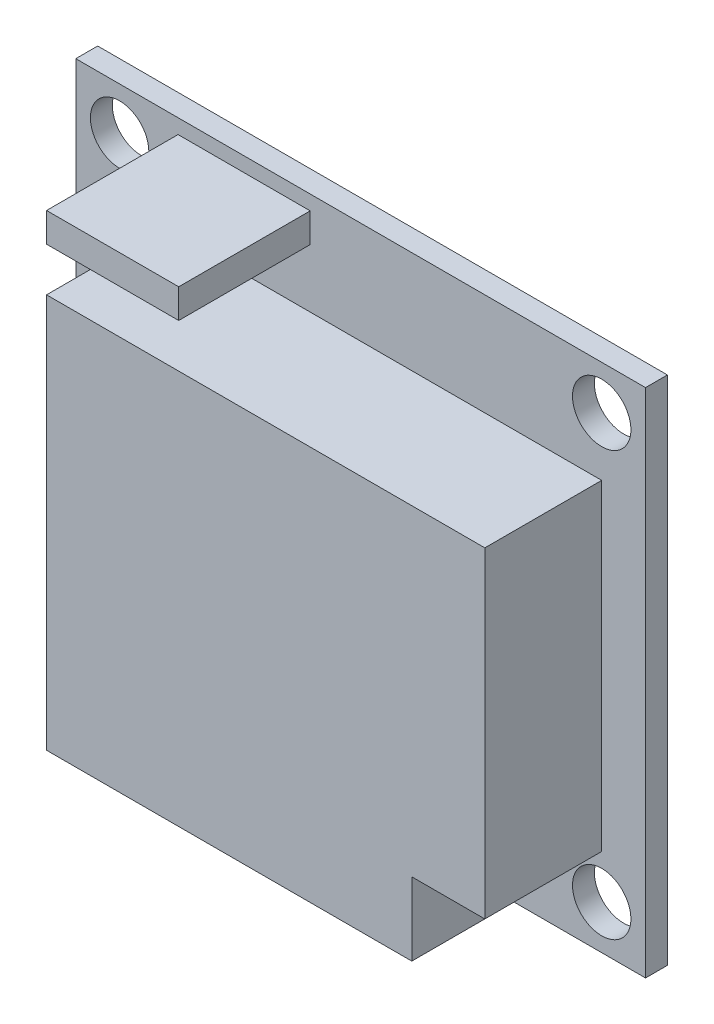
ISO-10303-21;
HEADER;
FILE_DESCRIPTION(('STEP AP214'),'2;1');
FILE_NAME('part.step','',(''),(''),'','','');
FILE_SCHEMA(('AUTOMOTIVE_DESIGN { 1 0 10303 214 1 1 1 1 }'));
ENDSEC;
DATA;
#1=APPLICATION_CONTEXT('core data for automotive mechanical design processes');
#2=APPLICATION_PROTOCOL_DEFINITION('international standard','automotive_design',2000,#1);
#3=PRODUCT_CONTEXT('',#1,'mechanical');
#4=PRODUCT('Part','Part','',(#3));
#5=PRODUCT_RELATED_PRODUCT_CATEGORY('part','',(#4));
#6=PRODUCT_DEFINITION_FORMATION('','',#4);
#7=PRODUCT_DEFINITION_CONTEXT('part definition',#1,'design');
#8=PRODUCT_DEFINITION('design','',#6,#7);
#9=PRODUCT_DEFINITION_SHAPE('','',#8);
#10=(LENGTH_UNIT() NAMED_UNIT(*) SI_UNIT(.MILLI.,.METRE.));
#11=(NAMED_UNIT(*) PLANE_ANGLE_UNIT() SI_UNIT($,.RADIAN.));
#12=(NAMED_UNIT(*) SI_UNIT($,.STERADIAN.) SOLID_ANGLE_UNIT());
#13=UNCERTAINTY_MEASURE_WITH_UNIT(LENGTH_MEASURE(1.E-05),#10,'distance_accuracy_value','');
#14=(GEOMETRIC_REPRESENTATION_CONTEXT(3) GLOBAL_UNCERTAINTY_ASSIGNED_CONTEXT((#13)) GLOBAL_UNIT_ASSIGNED_CONTEXT((#10,
#11,#12)) REPRESENTATION_CONTEXT('',''));
#15=CARTESIAN_POINT('',(0.,0.,0.));
#16=DIRECTION('',(0.,0.,1.));
#17=DIRECTION('',(1.,0.,0.));
#18=AXIS2_PLACEMENT_3D('',#15,#16,#17);
#19=CARTESIAN_POINT('',(0.,0.,1.5));
#20=DIRECTION('',(0.,0.,-1.));
#21=DIRECTION('',(-1.,0.,0.));
#22=AXIS2_PLACEMENT_3D('',#19,#20,#21);
#23=PLANE('',#22);
#24=DIRECTION('',(0.,-1.,0.));
#25=VECTOR('',#24,1.);
#26=CARTESIAN_POINT('',(-12.5,16.5,1.5));
#27=LINE('',#26,#25);
#28=CARTESIAN_POINT('',(-12.5,16.5,1.5));
#29=VERTEX_POINT('',#28);
#30=CARTESIAN_POINT('',(-12.5,14.5,1.5));
#31=VERTEX_POINT('',#30);
#32=EDGE_CURVE('E165',#29,#31,#27,.T.);
#33=ORIENTED_EDGE('',*,*,#32,.F.);
#34=DIRECTION('',(-1.,0.,0.));
#35=VECTOR('',#34,1.);
#36=CARTESIAN_POINT('',(-12.5,16.5,1.5));
#37=LINE('',#36,#35);
#38=CARTESIAN_POINT('',(-3.45411790643712,16.5,1.5));
#39=VERTEX_POINT('',#38);
#40=EDGE_CURVE('E181',#39,#29,#37,.T.);
#41=ORIENTED_EDGE('',*,*,#40,.F.);
#42=DIRECTION('',(0.,1.,0.));
#43=VECTOR('',#42,1.);
#44=CARTESIAN_POINT('',(-3.45411790643712,16.5,1.5));
#45=LINE('',#44,#43);
#46=CARTESIAN_POINT('',(-3.45411790643712,14.5,1.5));
#47=VERTEX_POINT('',#46);
#48=EDGE_CURVE('E194',#47,#39,#45,.T.);
#49=ORIENTED_EDGE('',*,*,#48,.F.);
#50=DIRECTION('',(1.,0.,0.));
#51=VECTOR('',#50,1.);
#52=CARTESIAN_POINT('',(-12.5,14.5,1.5));
#53=LINE('',#52,#51);
#54=EDGE_CURVE('E170',#31,#47,#53,.T.);
#55=ORIENTED_EDGE('',*,*,#54,.F.);
#56=EDGE_LOOP('',(#33,#41,#49,#55));
#57=FACE_BOUND('',#56,.T.);
#58=CARTESIAN_POINT('',(-16.5,14.5,1.5));
#59=DIRECTION('',(0.,0.,1.));
#60=DIRECTION('',(1.,0.,0.));
#61=AXIS2_PLACEMENT_3D('',#58,#59,#60);
#62=CIRCLE('',#61,2.);
#63=CARTESIAN_POINT('',(-14.5,14.5,1.5));
#64=VERTEX_POINT('',#63);
#65=EDGE_CURVE('E220',#64,#64,#62,.T.);
#66=ORIENTED_EDGE('',*,*,#65,.F.);
#67=EDGE_LOOP('',(#66));
#68=FACE_BOUND('',#67,.T.);
#69=CARTESIAN_POINT('',(16.5,14.5,1.5));
#70=DIRECTION('',(0.,0.,1.));
#71=DIRECTION('',(1.,0.,0.));
#72=AXIS2_PLACEMENT_3D('',#69,#70,#71);
#73=CIRCLE('',#72,2.);
#74=CARTESIAN_POINT('',(18.5,14.5,1.5));
#75=VERTEX_POINT('',#74);
#76=EDGE_CURVE('E225',#75,#75,#73,.T.);
#77=ORIENTED_EDGE('',*,*,#76,.F.);
#78=EDGE_LOOP('',(#77));
#79=FACE_BOUND('',#78,.T.);
#80=DIRECTION('',(0.,1.,0.));
#81=VECTOR('',#80,1.);
#82=CARTESIAN_POINT('',(19.5,-17.5,1.5));
#83=LINE('',#82,#81);
#84=CARTESIAN_POINT('',(19.5,-17.5,1.5));
#85=VERTEX_POINT('',#84);
#86=CARTESIAN_POINT('',(19.5,17.5,1.5));
#87=VERTEX_POINT('',#86);
#88=EDGE_CURVE('E233',#85,#87,#83,.T.);
#89=ORIENTED_EDGE('',*,*,#88,.T.);
#90=DIRECTION('',(-1.,0.,0.));
#91=VECTOR('',#90,1.);
#92=CARTESIAN_POINT('',(-19.5,17.5,1.5));
#93=LINE('',#92,#91);
#94=CARTESIAN_POINT('',(-19.5,17.5,1.5));
#95=VERTEX_POINT('',#94);
#96=EDGE_CURVE('E237',#87,#95,#93,.T.);
#97=ORIENTED_EDGE('',*,*,#96,.T.);
#98=DIRECTION('',(0.,-1.,0.));
#99=VECTOR('',#98,1.);
#100=CARTESIAN_POINT('',(-19.5,-17.5,1.5));
#101=LINE('',#100,#99);
#102=CARTESIAN_POINT('',(-19.5,-17.5,1.5));
#103=VERTEX_POINT('',#102);
#104=EDGE_CURVE('E241',#95,#103,#101,.T.);
#105=ORIENTED_EDGE('',*,*,#104,.T.);
#106=DIRECTION('',(1.,0.,0.));
#107=VECTOR('',#106,1.);
#108=CARTESIAN_POINT('',(-19.5,-17.5,1.5));
#109=LINE('',#108,#107);
#110=EDGE_CURVE('E244',#103,#85,#109,.T.);
#111=ORIENTED_EDGE('',*,*,#110,.T.);
#112=EDGE_LOOP('',(#89,#97,#105,#111));
#113=FACE_BOUND('',#112,.T.);
#114=CARTESIAN_POINT('',(16.5,-14.5,1.5));
#115=DIRECTION('',(0.,0.,1.));
#116=DIRECTION('',(1.,0.,0.));
#117=AXIS2_PLACEMENT_3D('',#114,#115,#116);
#118=CIRCLE('',#117,2.);
#119=CARTESIAN_POINT('',(18.5,-14.5,1.5));
#120=VERTEX_POINT('',#119);
#121=EDGE_CURVE('E278',#120,#120,#118,.T.);
#122=ORIENTED_EDGE('',*,*,#121,.F.);
#123=EDGE_LOOP('',(#122));
#124=FACE_BOUND('',#123,.T.);
#125=CARTESIAN_POINT('',(-16.5,-14.5,1.5));
#126=DIRECTION('',(0.,0.,1.));
#127=DIRECTION('',(1.,0.,0.));
#128=AXIS2_PLACEMENT_3D('',#125,#126,#127);
#129=CIRCLE('',#128,2.);
#130=CARTESIAN_POINT('',(-14.5,-14.5,1.5));
#131=VERTEX_POINT('',#130);
#132=EDGE_CURVE('E11',#131,#131,#129,.T.);
#133=ORIENTED_EDGE('',*,*,#132,.F.);
#134=EDGE_LOOP('',(#133));
#135=FACE_BOUND('',#134,.T.);
#136=DIRECTION('',(0.,-1.,0.));
#137=VECTOR('',#136,1.);
#138=CARTESIAN_POINT('',(-13.5,10.5,1.5));
#139=LINE('',#138,#137);
#140=CARTESIAN_POINT('',(-13.5,10.5,1.5));
#141=VERTEX_POINT('',#140);
#142=CARTESIAN_POINT('',(-13.5,-16.5,1.5));
#143=VERTEX_POINT('',#142);
#144=EDGE_CURVE('E163',#141,#143,#139,.T.);
#145=ORIENTED_EDGE('',*,*,#144,.F.);
#146=DIRECTION('',(-1.,0.,0.));
#147=VECTOR('',#146,1.);
#148=CARTESIAN_POINT('',(-13.5,10.5,1.5));
#149=LINE('',#148,#147);
#150=CARTESIAN_POINT('',(16.5,10.5,1.5));
#151=VERTEX_POINT('',#150);
#152=EDGE_CURVE('E160',#151,#141,#149,.T.);
#153=ORIENTED_EDGE('',*,*,#152,.F.);
#154=DIRECTION('',(0.,1.,0.));
#155=VECTOR('',#154,1.);
#156=CARTESIAN_POINT('',(16.5,10.5,1.5));
#157=LINE('',#156,#155);
#158=CARTESIAN_POINT('',(16.5,-11.5,1.5));
#159=VERTEX_POINT('',#158);
#160=EDGE_CURVE('E306',#159,#151,#157,.T.);
#161=ORIENTED_EDGE('',*,*,#160,.F.);
#162=DIRECTION('',(1.,0.,0.));
#163=VECTOR('',#162,1.);
#164=CARTESIAN_POINT('',(11.5,-11.5,1.5));
#165=LINE('',#164,#163);
#166=CARTESIAN_POINT('',(11.5,-11.5,1.5));
#167=VERTEX_POINT('',#166);
#168=EDGE_CURVE('E328',#167,#159,#165,.T.);
#169=ORIENTED_EDGE('',*,*,#168,.F.);
#170=DIRECTION('',(0.,1.,0.));
#171=VECTOR('',#170,1.);
#172=CARTESIAN_POINT('',(11.5,-16.5,1.5));
#173=LINE('',#172,#171);
#174=CARTESIAN_POINT('',(11.5,-16.5,1.5));
#175=VERTEX_POINT('',#174);
#176=EDGE_CURVE('E60',#175,#167,#173,.T.);
#177=ORIENTED_EDGE('',*,*,#176,.F.);
#178=DIRECTION('',(1.,0.,0.));
#179=VECTOR('',#178,1.);
#180=CARTESIAN_POINT('',(-13.5,-16.5,1.5));
#181=LINE('',#180,#179);
#182=EDGE_CURVE('E55',#143,#175,#181,.T.);
#183=ORIENTED_EDGE('',*,*,#182,.F.);
#184=EDGE_LOOP('',(#145,#153,#161,#169,#177,#183));
#185=FACE_BOUND('',#184,.T.);
#186=ADVANCED_FACE('F39',(#57,#68,#79,#113,#124,#135,#185),#23,.F.);
#187=CARTESIAN_POINT('',(-16.5,-14.5,-0.000999999999999916));
#188=DIRECTION('',(0.,0.,1.));
#189=DIRECTION('',(1.,0.,0.));
#190=AXIS2_PLACEMENT_3D('',#187,#188,#189);
#191=CYLINDRICAL_SURFACE('',#190,2.);
#192=CARTESIAN_POINT('',(-16.5,-14.5,0.));
#193=DIRECTION('',(0.,0.,-1.));
#194=DIRECTION('',(-1.,0.,0.));
#195=AXIS2_PLACEMENT_3D('',#192,#193,#194);
#196=CIRCLE('',#195,2.);
#197=CARTESIAN_POINT('',(-18.5,-14.5,0.));
#198=VERTEX_POINT('',#197);
#199=EDGE_CURVE('E48',#198,#198,#196,.F.);
#200=ORIENTED_EDGE('',*,*,#199,.F.);
#201=EDGE_LOOP('',(#200));
#202=FACE_BOUND('',#201,.T.);
#203=ORIENTED_EDGE('',*,*,#132,.T.);
#204=EDGE_LOOP('',(#203));
#205=FACE_BOUND('',#204,.T.);
#206=ADVANCED_FACE('F41',(#202,#205),#191,.F.);
#207=CARTESIAN_POINT('',(16.5,-14.5,-0.000999999999999916));
#208=DIRECTION('',(0.,0.,1.));
#209=DIRECTION('',(1.,0.,0.));
#210=AXIS2_PLACEMENT_3D('',#207,#208,#209);
#211=CYLINDRICAL_SURFACE('',#210,2.);
#212=CARTESIAN_POINT('',(16.5,-14.5,0.));
#213=DIRECTION('',(0.,0.,-1.));
#214=DIRECTION('',(-1.,0.,0.));
#215=AXIS2_PLACEMENT_3D('',#212,#213,#214);
#216=CIRCLE('',#215,2.);
#217=CARTESIAN_POINT('',(14.5,-14.5,0.));
#218=VERTEX_POINT('',#217);
#219=EDGE_CURVE('E274',#218,#218,#216,.F.);
#220=ORIENTED_EDGE('',*,*,#219,.F.);
#221=EDGE_LOOP('',(#220));
#222=FACE_BOUND('',#221,.T.);
#223=ORIENTED_EDGE('',*,*,#121,.T.);
#224=EDGE_LOOP('',(#223));
#225=FACE_BOUND('',#224,.T.);
#226=ADVANCED_FACE('F289',(#222,#225),#211,.F.);
#227=CARTESIAN_POINT('',(19.5,-17.5,1.5));
#228=DIRECTION('',(-1.,0.,0.));
#229=DIRECTION('',(0.,0.,1.));
#230=AXIS2_PLACEMENT_3D('',#227,#228,#229);
#231=PLANE('',#230);
#232=DIRECTION('',(0.,1.,0.));
#233=VECTOR('',#232,1.);
#234=CARTESIAN_POINT('',(19.5,-17.5,0.));
#235=LINE('',#234,#233);
#236=CARTESIAN_POINT('',(19.5,-17.5,0.));
#237=VERTEX_POINT('',#236);
#238=CARTESIAN_POINT('',(19.5,17.5,0.));
#239=VERTEX_POINT('',#238);
#240=EDGE_CURVE('E229',#237,#239,#235,.T.);
#241=ORIENTED_EDGE('',*,*,#240,.T.);
#242=DIRECTION('',(0.,0.,-1.));
#243=VECTOR('',#242,1.);
#244=CARTESIAN_POINT('',(19.5,17.5,1.5));
#245=LINE('',#244,#243);
#246=EDGE_CURVE('E270',#87,#239,#245,.T.);
#247=ORIENTED_EDGE('',*,*,#246,.F.);
#248=ORIENTED_EDGE('',*,*,#88,.F.);
#249=DIRECTION('',(0.,0.,-1.));
#250=VECTOR('',#249,1.);
#251=CARTESIAN_POINT('',(19.5,-17.5,1.5));
#252=LINE('',#251,#250);
#253=EDGE_CURVE('E247',#85,#237,#252,.T.);
#254=ORIENTED_EDGE('',*,*,#253,.T.);
#255=EDGE_LOOP('',(#241,#247,#248,#254));
#256=FACE_BOUND('',#255,.T.);
#257=ADVANCED_FACE('F406',(#256),#231,.F.);
#258=CARTESIAN_POINT('',(-19.5,17.5,1.5));
#259=DIRECTION('',(0.,-1.,0.));
#260=DIRECTION('',(0.,0.,-1.));
#261=AXIS2_PLACEMENT_3D('',#258,#259,#260);
#262=PLANE('',#261);
#263=DIRECTION('',(-1.,0.,0.));
#264=VECTOR('',#263,1.);
#265=CARTESIAN_POINT('',(-19.5,17.5,0.));
#266=LINE('',#265,#264);
#267=CARTESIAN_POINT('',(-19.5,17.5,0.));
#268=VERTEX_POINT('',#267);
#269=EDGE_CURVE('E251',#239,#268,#266,.T.);
#270=ORIENTED_EDGE('',*,*,#269,.T.);
#271=DIRECTION('',(0.,0.,-1.));
#272=VECTOR('',#271,1.);
#273=CARTESIAN_POINT('',(-19.5,17.5,1.5));
#274=LINE('',#273,#272);
#275=EDGE_CURVE('E266',#95,#268,#274,.T.);
#276=ORIENTED_EDGE('',*,*,#275,.F.);
#277=ORIENTED_EDGE('',*,*,#96,.F.);
#278=ORIENTED_EDGE('',*,*,#246,.T.);
#279=EDGE_LOOP('',(#270,#276,#277,#278));
#280=FACE_BOUND('',#279,.T.);
#281=ADVANCED_FACE('F402',(#280),#262,.F.);
#282=CARTESIAN_POINT('',(-19.5,-17.5,1.5));
#283=DIRECTION('',(1.,0.,0.));
#284=DIRECTION('',(0.,0.,-1.));
#285=AXIS2_PLACEMENT_3D('',#282,#283,#284);
#286=PLANE('',#285);
#287=DIRECTION('',(0.,-1.,0.));
#288=VECTOR('',#287,1.);
#289=CARTESIAN_POINT('',(-19.5,-17.5,0.));
#290=LINE('',#289,#288);
#291=CARTESIAN_POINT('',(-19.5,-17.5,0.));
#292=VERTEX_POINT('',#291);
#293=EDGE_CURVE('E254',#268,#292,#290,.T.);
#294=ORIENTED_EDGE('',*,*,#293,.T.);
#295=DIRECTION('',(0.,0.,-1.));
#296=VECTOR('',#295,1.);
#297=CARTESIAN_POINT('',(-19.5,-17.5,1.5));
#298=LINE('',#297,#296);
#299=EDGE_CURVE('E262',#103,#292,#298,.T.);
#300=ORIENTED_EDGE('',*,*,#299,.F.);
#301=ORIENTED_EDGE('',*,*,#104,.F.);
#302=ORIENTED_EDGE('',*,*,#275,.T.);
#303=EDGE_LOOP('',(#294,#300,#301,#302));
#304=FACE_BOUND('',#303,.T.);
#305=ADVANCED_FACE('F398',(#304),#286,.F.);
#306=CARTESIAN_POINT('',(-19.5,-17.5,1.5));
#307=DIRECTION('',(0.,1.,0.));
#308=DIRECTION('',(0.,0.,1.));
#309=AXIS2_PLACEMENT_3D('',#306,#307,#308);
#310=PLANE('',#309);
#311=DIRECTION('',(1.,0.,0.));
#312=VECTOR('',#311,1.);
#313=CARTESIAN_POINT('',(-19.5,-17.5,0.));
#314=LINE('',#313,#312);
#315=EDGE_CURVE('E238',#292,#237,#314,.T.);
#316=ORIENTED_EDGE('',*,*,#315,.T.);
#317=ORIENTED_EDGE('',*,*,#253,.F.);
#318=ORIENTED_EDGE('',*,*,#110,.F.);
#319=ORIENTED_EDGE('',*,*,#299,.T.);
#320=EDGE_LOOP('',(#316,#317,#318,#319));
#321=FACE_BOUND('',#320,.T.);
#322=ADVANCED_FACE('F394',(#321),#310,.F.);
#323=CARTESIAN_POINT('',(0.,0.,0.));
#324=DIRECTION('',(0.,0.,-1.));
#325=DIRECTION('',(-1.,0.,0.));
#326=AXIS2_PLACEMENT_3D('',#323,#324,#325);
#327=PLANE('',#326);
#328=CARTESIAN_POINT('',(-16.5,14.5,0.));
#329=DIRECTION('',(0.,0.,-1.));
#330=DIRECTION('',(-1.,0.,0.));
#331=AXIS2_PLACEMENT_3D('',#328,#329,#330);
#332=CIRCLE('',#331,2.);
#333=CARTESIAN_POINT('',(-18.5,14.5,0.));
#334=VERTEX_POINT('',#333);
#335=EDGE_CURVE('E216',#334,#334,#332,.F.);
#336=ORIENTED_EDGE('',*,*,#335,.T.);
#337=EDGE_LOOP('',(#336));
#338=FACE_BOUND('',#337,.T.);
#339=CARTESIAN_POINT('',(16.5,14.5,0.));
#340=DIRECTION('',(0.,0.,-1.));
#341=DIRECTION('',(-1.,0.,0.));
#342=AXIS2_PLACEMENT_3D('',#339,#340,#341);
#343=CIRCLE('',#342,2.);
#344=CARTESIAN_POINT('',(14.5,14.5,0.));
#345=VERTEX_POINT('',#344);
#346=EDGE_CURVE('E224',#345,#345,#343,.F.);
#347=ORIENTED_EDGE('',*,*,#346,.T.);
#348=EDGE_LOOP('',(#347));
#349=FACE_BOUND('',#348,.T.);
#350=ORIENTED_EDGE('',*,*,#240,.F.);
#351=ORIENTED_EDGE('',*,*,#315,.F.);
#352=ORIENTED_EDGE('',*,*,#293,.F.);
#353=ORIENTED_EDGE('',*,*,#269,.F.);
#354=EDGE_LOOP('',(#350,#351,#352,#353));
#355=FACE_BOUND('',#354,.T.);
#356=ORIENTED_EDGE('',*,*,#219,.T.);
#357=EDGE_LOOP('',(#356));
#358=FACE_BOUND('',#357,.T.);
#359=ORIENTED_EDGE('',*,*,#199,.T.);
#360=EDGE_LOOP('',(#359));
#361=FACE_BOUND('',#360,.T.);
#362=ADVANCED_FACE('F285',(#338,#349,#355,#358,#361),#327,.T.);
#363=CARTESIAN_POINT('',(16.5,14.5,-0.000999999999999916));
#364=DIRECTION('',(0.,0.,1.));
#365=DIRECTION('',(1.,0.,0.));
#366=AXIS2_PLACEMENT_3D('',#363,#364,#365);
#367=CYLINDRICAL_SURFACE('',#366,2.);
#368=ORIENTED_EDGE('',*,*,#346,.F.);
#369=EDGE_LOOP('',(#368));
#370=FACE_BOUND('',#369,.T.);
#371=ORIENTED_EDGE('',*,*,#76,.T.);
#372=EDGE_LOOP('',(#371));
#373=FACE_BOUND('',#372,.T.);
#374=ADVANCED_FACE('F387',(#370,#373),#367,.F.);
#375=CARTESIAN_POINT('',(-16.5,14.5,-0.000999999999999916));
#376=DIRECTION('',(0.,0.,1.));
#377=DIRECTION('',(1.,0.,0.));
#378=AXIS2_PLACEMENT_3D('',#375,#376,#377);
#379=CYLINDRICAL_SURFACE('',#378,2.);
#380=ORIENTED_EDGE('',*,*,#335,.F.);
#381=EDGE_LOOP('',(#380));
#382=FACE_BOUND('',#381,.T.);
#383=ORIENTED_EDGE('',*,*,#65,.T.);
#384=EDGE_LOOP('',(#383));
#385=FACE_BOUND('',#384,.T.);
#386=ADVANCED_FACE('F383',(#382,#385),#379,.F.);
#387=CARTESIAN_POINT('',(-12.5,16.5,10.5));
#388=DIRECTION('',(1.,0.,0.));
#389=DIRECTION('',(0.,0.,-1.));
#390=AXIS2_PLACEMENT_3D('',#387,#388,#389);
#391=PLANE('',#390);
#392=ORIENTED_EDGE('',*,*,#32,.T.);
#393=DIRECTION('',(0.,0.,-1.));
#394=VECTOR('',#393,1.);
#395=CARTESIAN_POINT('',(-12.5,14.5,10.5));
#396=LINE('',#395,#394);
#397=CARTESIAN_POINT('',(-12.5,14.5,10.5));
#398=VERTEX_POINT('',#397);
#399=EDGE_CURVE('E212',#398,#31,#396,.T.);
#400=ORIENTED_EDGE('',*,*,#399,.F.);
#401=DIRECTION('',(0.,-1.,0.));
#402=VECTOR('',#401,1.);
#403=CARTESIAN_POINT('',(-12.5,16.5,10.5));
#404=LINE('',#403,#402);
#405=CARTESIAN_POINT('',(-12.5,16.5,10.5));
#406=VERTEX_POINT('',#405);
#407=EDGE_CURVE('E176',#406,#398,#404,.T.);
#408=ORIENTED_EDGE('',*,*,#407,.F.);
#409=DIRECTION('',(0.,0.,-1.));
#410=VECTOR('',#409,1.);
#411=CARTESIAN_POINT('',(-12.5,16.5,10.5));
#412=LINE('',#411,#410);
#413=EDGE_CURVE('E189',#406,#29,#412,.T.);
#414=ORIENTED_EDGE('',*,*,#413,.T.);
#415=EDGE_LOOP('',(#392,#400,#408,#414));
#416=FACE_BOUND('',#415,.T.);
#417=ADVANCED_FACE('F379',(#416),#391,.F.);
#418=CARTESIAN_POINT('',(-12.5,14.5,10.5));
#419=DIRECTION('',(0.,1.,0.));
#420=DIRECTION('',(0.,0.,1.));
#421=AXIS2_PLACEMENT_3D('',#418,#419,#420);
#422=PLANE('',#421);
#423=ORIENTED_EDGE('',*,*,#54,.T.);
#424=DIRECTION('',(0.,0.,-1.));
#425=VECTOR('',#424,1.);
#426=CARTESIAN_POINT('',(-3.45411790643712,14.5,10.5));
#427=LINE('',#426,#425);
#428=CARTESIAN_POINT('',(-3.45411790643712,14.5,10.5));
#429=VERTEX_POINT('',#428);
#430=EDGE_CURVE('E208',#429,#47,#427,.T.);
#431=ORIENTED_EDGE('',*,*,#430,.F.);
#432=DIRECTION('',(1.,0.,0.));
#433=VECTOR('',#432,1.);
#434=CARTESIAN_POINT('',(-12.5,14.5,10.5));
#435=LINE('',#434,#433);
#436=EDGE_CURVE('E180',#398,#429,#435,.T.);
#437=ORIENTED_EDGE('',*,*,#436,.F.);
#438=ORIENTED_EDGE('',*,*,#399,.T.);
#439=EDGE_LOOP('',(#423,#431,#437,#438));
#440=FACE_BOUND('',#439,.T.);
#441=ADVANCED_FACE('F375',(#440),#422,.F.);
#442=CARTESIAN_POINT('',(-3.45411790643712,16.5,10.5));
#443=DIRECTION('',(-1.,0.,0.));
#444=DIRECTION('',(0.,-1.,0.));
#445=AXIS2_PLACEMENT_3D('',#442,#443,#444);
#446=PLANE('',#445);
#447=ORIENTED_EDGE('',*,*,#48,.T.);
#448=DIRECTION('',(0.,0.,-1.));
#449=VECTOR('',#448,1.);
#450=CARTESIAN_POINT('',(-3.45411790643712,16.5,10.5));
#451=LINE('',#450,#449);
#452=CARTESIAN_POINT('',(-3.45411790643712,16.5,10.5));
#453=VERTEX_POINT('',#452);
#454=EDGE_CURVE('E204',#453,#39,#451,.T.);
#455=ORIENTED_EDGE('',*,*,#454,.F.);
#456=DIRECTION('',(0.,1.,0.));
#457=VECTOR('',#456,1.);
#458=CARTESIAN_POINT('',(-3.45411790643712,16.5,10.5));
#459=LINE('',#458,#457);
#460=EDGE_CURVE('E184',#429,#453,#459,.T.);
#461=ORIENTED_EDGE('',*,*,#460,.F.);
#462=ORIENTED_EDGE('',*,*,#430,.T.);
#463=EDGE_LOOP('',(#447,#455,#461,#462));
#464=FACE_BOUND('',#463,.T.);
#465=ADVANCED_FACE('F371',(#464),#446,.F.);
#466=CARTESIAN_POINT('',(-12.5,16.5,10.5));
#467=DIRECTION('',(0.,-1.,0.));
#468=DIRECTION('',(0.,0.,-1.));
#469=AXIS2_PLACEMENT_3D('',#466,#467,#468);
#470=PLANE('',#469);
#471=ORIENTED_EDGE('',*,*,#40,.T.);
#472=ORIENTED_EDGE('',*,*,#413,.F.);
#473=DIRECTION('',(-1.,0.,0.));
#474=VECTOR('',#473,1.);
#475=CARTESIAN_POINT('',(-12.5,16.5,10.5));
#476=LINE('',#475,#474);
#477=EDGE_CURVE('E187',#453,#406,#476,.T.);
#478=ORIENTED_EDGE('',*,*,#477,.F.);
#479=ORIENTED_EDGE('',*,*,#454,.T.);
#480=EDGE_LOOP('',(#471,#472,#478,#479));
#481=FACE_BOUND('',#480,.T.);
#482=ADVANCED_FACE('F367',(#481),#470,.F.);
#483=CARTESIAN_POINT('',(0.,0.,10.5));
#484=DIRECTION('',(0.,0.,1.));
#485=DIRECTION('',(1.,0.,0.));
#486=AXIS2_PLACEMENT_3D('',#483,#484,#485);
#487=PLANE('',#486);
#488=ORIENTED_EDGE('',*,*,#407,.T.);
#489=ORIENTED_EDGE('',*,*,#436,.T.);
#490=ORIENTED_EDGE('',*,*,#460,.T.);
#491=ORIENTED_EDGE('',*,*,#477,.T.);
#492=EDGE_LOOP('',(#488,#489,#490,#491));
#493=FACE_BOUND('',#492,.T.);
#494=ADVANCED_FACE('F364',(#493),#487,.T.);
#495=CARTESIAN_POINT('',(-13.5,10.5,9.5));
#496=DIRECTION('',(1.,0.,0.));
#497=DIRECTION('',(0.,1.,0.));
#498=AXIS2_PLACEMENT_3D('',#495,#496,#497);
#499=PLANE('',#498);
#500=ORIENTED_EDGE('',*,*,#144,.T.);
#501=DIRECTION('',(0.,0.,-1.));
#502=VECTOR('',#501,1.);
#503=CARTESIAN_POINT('',(-13.5,-16.5,9.5));
#504=LINE('',#503,#502);
#505=CARTESIAN_POINT('',(-13.5,-16.5,9.5));
#506=VERTEX_POINT('',#505);
#507=EDGE_CURVE('E142',#506,#143,#504,.T.);
#508=ORIENTED_EDGE('',*,*,#507,.F.);
#509=DIRECTION('',(0.,-1.,0.));
#510=VECTOR('',#509,1.);
#511=CARTESIAN_POINT('',(-13.5,10.5,9.5));
#512=LINE('',#511,#510);
#513=CARTESIAN_POINT('',(-13.5,10.5,9.5));
#514=VERTEX_POINT('',#513);
#515=EDGE_CURVE('E150',#514,#506,#512,.T.);
#516=ORIENTED_EDGE('',*,*,#515,.F.);
#517=DIRECTION('',(0.,0.,-1.));
#518=VECTOR('',#517,1.);
#519=CARTESIAN_POINT('',(-13.5,10.5,9.5));
#520=LINE('',#519,#518);
#521=EDGE_CURVE('E302',#514,#141,#520,.T.);
#522=ORIENTED_EDGE('',*,*,#521,.T.);
#523=EDGE_LOOP('',(#500,#508,#516,#522));
#524=FACE_BOUND('',#523,.T.);
#525=ADVANCED_FACE('F162',(#524),#499,.F.);
#526=CARTESIAN_POINT('',(-13.5,-16.5,9.5));
#527=DIRECTION('',(0.,1.,0.));
#528=DIRECTION('',(0.,0.,1.));
#529=AXIS2_PLACEMENT_3D('',#526,#527,#528);
#530=PLANE('',#529);
#531=ORIENTED_EDGE('',*,*,#182,.T.);
#532=DIRECTION('',(0.,0.,-1.));
#533=VECTOR('',#532,1.);
#534=CARTESIAN_POINT('',(11.5,-16.5,9.5));
#535=LINE('',#534,#533);
#536=CARTESIAN_POINT('',(11.5,-16.5,9.5));
#537=VERTEX_POINT('',#536);
#538=EDGE_CURVE('E145',#537,#175,#535,.T.);
#539=ORIENTED_EDGE('',*,*,#538,.F.);
#540=DIRECTION('',(1.,0.,0.));
#541=VECTOR('',#540,1.);
#542=CARTESIAN_POINT('',(-13.5,-16.5,9.5));
#543=LINE('',#542,#541);
#544=EDGE_CURVE('E138',#506,#537,#543,.T.);
#545=ORIENTED_EDGE('',*,*,#544,.F.);
#546=ORIENTED_EDGE('',*,*,#507,.T.);
#547=EDGE_LOOP('',(#531,#539,#545,#546));
#548=FACE_BOUND('',#547,.T.);
#549=ADVANCED_FACE('F140',(#548),#530,.F.);
#550=CARTESIAN_POINT('',(11.5,-16.5,9.5));
#551=DIRECTION('',(-1.,0.,0.));
#552=DIRECTION('',(0.,0.,1.));
#553=AXIS2_PLACEMENT_3D('',#550,#551,#552);
#554=PLANE('',#553);
#555=ORIENTED_EDGE('',*,*,#176,.T.);
#556=DIRECTION('',(0.,0.,-1.));
#557=VECTOR('',#556,1.);
#558=CARTESIAN_POINT('',(11.5,-11.5,9.5));
#559=LINE('',#558,#557);
#560=CARTESIAN_POINT('',(11.5,-11.5,9.5));
#561=VERTEX_POINT('',#560);
#562=EDGE_CURVE('E172',#561,#167,#559,.T.);
#563=ORIENTED_EDGE('',*,*,#562,.F.);
#564=DIRECTION('',(0.,1.,0.));
#565=VECTOR('',#564,1.);
#566=CARTESIAN_POINT('',(11.5,-16.5,9.5));
#567=LINE('',#566,#565);
#568=EDGE_CURVE('E149',#537,#561,#567,.T.);
#569=ORIENTED_EDGE('',*,*,#568,.F.);
#570=ORIENTED_EDGE('',*,*,#538,.T.);
#571=EDGE_LOOP('',(#555,#563,#569,#570));
#572=FACE_BOUND('',#571,.T.);
#573=ADVANCED_FACE('F331',(#572),#554,.F.);
#574=CARTESIAN_POINT('',(11.5,-11.5,9.5));
#575=DIRECTION('',(0.,1.,0.));
#576=DIRECTION('',(0.,0.,1.));
#577=AXIS2_PLACEMENT_3D('',#574,#575,#576);
#578=PLANE('',#577);
#579=ORIENTED_EDGE('',*,*,#168,.T.);
#580=DIRECTION('',(0.,0.,-1.));
#581=VECTOR('',#580,1.);
#582=CARTESIAN_POINT('',(16.5,-11.5,9.5));
#583=LINE('',#582,#581);
#584=CARTESIAN_POINT('',(16.5,-11.5,9.5));
#585=VERTEX_POINT('',#584);
#586=EDGE_CURVE('E312',#585,#159,#583,.T.);
#587=ORIENTED_EDGE('',*,*,#586,.F.);
#588=DIRECTION('',(1.,0.,0.));
#589=VECTOR('',#588,1.);
#590=CARTESIAN_POINT('',(11.5,-11.5,9.5));
#591=LINE('',#590,#589);
#592=EDGE_CURVE('E329',#561,#585,#591,.T.);
#593=ORIENTED_EDGE('',*,*,#592,.F.);
#594=ORIENTED_EDGE('',*,*,#562,.T.);
#595=EDGE_LOOP('',(#579,#587,#593,#594));
#596=FACE_BOUND('',#595,.T.);
#597=ADVANCED_FACE('F326',(#596),#578,.F.);
#598=CARTESIAN_POINT('',(16.5,10.5,9.5));
#599=DIRECTION('',(-1.,0.,0.));
#600=DIRECTION('',(0.,-1.,0.));
#601=AXIS2_PLACEMENT_3D('',#598,#599,#600);
#602=PLANE('',#601);
#603=ORIENTED_EDGE('',*,*,#160,.T.);
#604=DIRECTION('',(0.,0.,-1.));
#605=VECTOR('',#604,1.);
#606=CARTESIAN_POINT('',(16.5,10.5,9.5));
#607=LINE('',#606,#605);
#608=CARTESIAN_POINT('',(16.5,10.5,9.5));
#609=VERTEX_POINT('',#608);
#610=EDGE_CURVE('E304',#609,#151,#607,.T.);
#611=ORIENTED_EDGE('',*,*,#610,.F.);
#612=DIRECTION('',(0.,1.,0.));
#613=VECTOR('',#612,1.);
#614=CARTESIAN_POINT('',(16.5,10.5,9.5));
#615=LINE('',#614,#613);
#616=EDGE_CURVE('E314',#585,#609,#615,.T.);
#617=ORIENTED_EDGE('',*,*,#616,.F.);
#618=ORIENTED_EDGE('',*,*,#586,.T.);
#619=EDGE_LOOP('',(#603,#611,#617,#618));
#620=FACE_BOUND('',#619,.T.);
#621=ADVANCED_FACE('F340',(#620),#602,.F.);
#622=CARTESIAN_POINT('',(-13.5,10.5,9.5));
#623=DIRECTION('',(0.,-1.,0.));
#624=DIRECTION('',(0.,0.,-1.));
#625=AXIS2_PLACEMENT_3D('',#622,#623,#624);
#626=PLANE('',#625);
#627=ORIENTED_EDGE('',*,*,#152,.T.);
#628=ORIENTED_EDGE('',*,*,#521,.F.);
#629=DIRECTION('',(-1.,0.,0.));
#630=VECTOR('',#629,1.);
#631=CARTESIAN_POINT('',(-13.5,10.5,9.5));
#632=LINE('',#631,#630);
#633=EDGE_CURVE('E155',#609,#514,#632,.T.);
#634=ORIENTED_EDGE('',*,*,#633,.F.);
#635=ORIENTED_EDGE('',*,*,#610,.T.);
#636=EDGE_LOOP('',(#627,#628,#634,#635));
#637=FACE_BOUND('',#636,.T.);
#638=ADVANCED_FACE('F301',(#637),#626,.F.);
#639=CARTESIAN_POINT('',(0.,0.,9.5));
#640=DIRECTION('',(0.,0.,1.));
#641=DIRECTION('',(1.,0.,0.));
#642=AXIS2_PLACEMENT_3D('',#639,#640,#641);
#643=PLANE('',#642);
#644=ORIENTED_EDGE('',*,*,#515,.T.);
#645=ORIENTED_EDGE('',*,*,#544,.T.);
#646=ORIENTED_EDGE('',*,*,#568,.T.);
#647=ORIENTED_EDGE('',*,*,#592,.T.);
#648=ORIENTED_EDGE('',*,*,#616,.T.);
#649=ORIENTED_EDGE('',*,*,#633,.T.);
#650=EDGE_LOOP('',(#644,#645,#646,#647,#648,#649));
#651=FACE_BOUND('',#650,.T.);
#652=ADVANCED_FACE('F153',(#651),#643,.T.);
#653=CLOSED_SHELL('',(#186,#206,#226,#257,#281,#305,#322,#362,#374,#386,#417,#441,#465,#482,
#494,#525,#549,#573,#597,#621,#638,#652));
#654=MANIFOLD_SOLID_BREP('B2',#653);
#655=ADVANCED_BREP_SHAPE_REPRESENTATION('',(#18,#654),#14);
#656=SHAPE_DEFINITION_REPRESENTATION(#9,#655);
ENDSEC;
END-ISO-10303-21;
